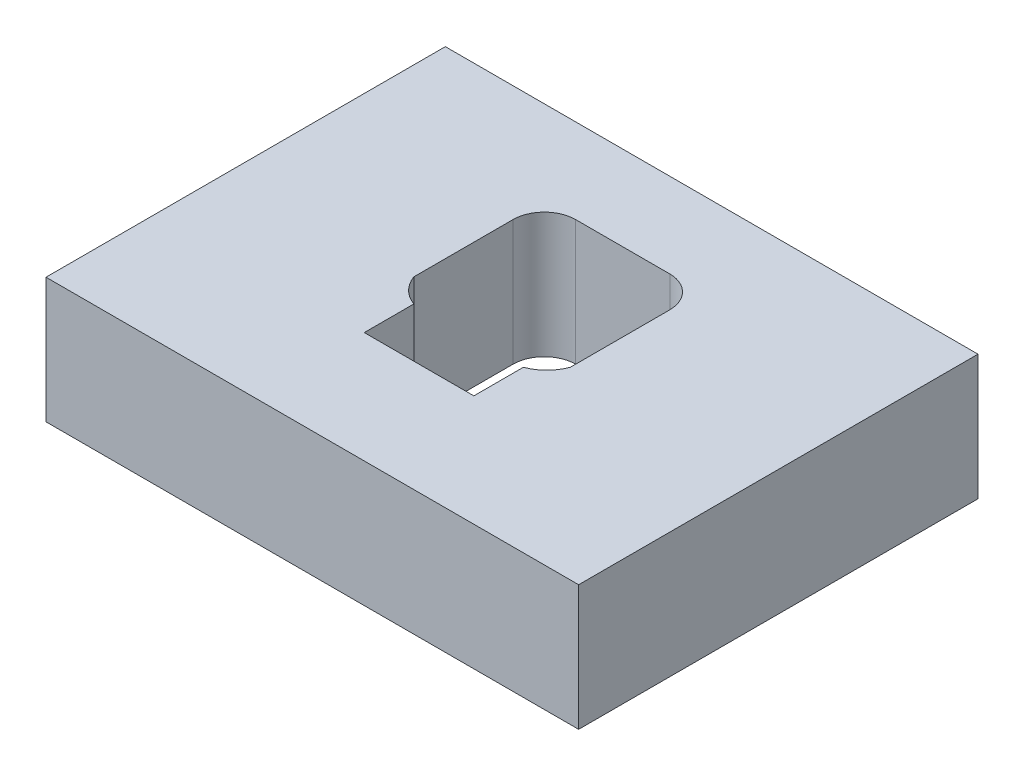
ISO-10303-21;
HEADER;
FILE_DESCRIPTION(('STEP AP214'),'2;1');
FILE_NAME('part.step','',(''),(''),'','','');
FILE_SCHEMA(('AUTOMOTIVE_DESIGN { 1 0 10303 214 1 1 1 1 }'));
ENDSEC;
DATA;
#1=APPLICATION_CONTEXT('core data for automotive mechanical design processes');
#2=APPLICATION_PROTOCOL_DEFINITION('international standard','automotive_design',2000,#1);
#3=PRODUCT_CONTEXT('',#1,'mechanical');
#4=PRODUCT('Part','Part','',(#3));
#5=PRODUCT_RELATED_PRODUCT_CATEGORY('part','',(#4));
#6=PRODUCT_DEFINITION_FORMATION('','',#4);
#7=PRODUCT_DEFINITION_CONTEXT('part definition',#1,'design');
#8=PRODUCT_DEFINITION('design','',#6,#7);
#9=PRODUCT_DEFINITION_SHAPE('','',#8);
#10=(LENGTH_UNIT() NAMED_UNIT(*) SI_UNIT(.MILLI.,.METRE.));
#11=(NAMED_UNIT(*) PLANE_ANGLE_UNIT() SI_UNIT($,.RADIAN.));
#12=(NAMED_UNIT(*) SI_UNIT($,.STERADIAN.) SOLID_ANGLE_UNIT());
#13=UNCERTAINTY_MEASURE_WITH_UNIT(LENGTH_MEASURE(1.E-05),#10,'distance_accuracy_value','');
#14=(GEOMETRIC_REPRESENTATION_CONTEXT(3) GLOBAL_UNCERTAINTY_ASSIGNED_CONTEXT((#13)) GLOBAL_UNIT_ASSIGNED_CONTEXT((#10,
#11,#12)) REPRESENTATION_CONTEXT('',''));
#15=CARTESIAN_POINT('',(0.,0.,0.));
#16=DIRECTION('',(0.,0.,1.));
#17=DIRECTION('',(1.,0.,0.));
#18=AXIS2_PLACEMENT_3D('',#15,#16,#17);
#19=CARTESIAN_POINT('',(-4.8,8.,0.));
#20=DIRECTION('',(1.,0.,0.));
#21=DIRECTION('',(0.,0.,-1.));
#22=AXIS2_PLACEMENT_3D('',#19,#20,#21);
#23=PLANE('',#22);
#24=DIRECTION('',(0.,0.,1.));
#25=VECTOR('',#24,1.);
#26=CARTESIAN_POINT('',(-4.8,0.,0.));
#27=LINE('',#26,#25);
#28=CARTESIAN_POINT('',(-4.8,0.,-19.7));
#29=VERTEX_POINT('',#28);
#30=CARTESIAN_POINT('',(-4.8,0.,5.80539238842786));
#31=VERTEX_POINT('',#30);
#32=EDGE_CURVE('E220',#29,#31,#27,.T.);
#33=ORIENTED_EDGE('',*,*,#32,.F.);
#34=DIRECTION('',(0.,-1.,0.));
#35=VECTOR('',#34,1.);
#36=CARTESIAN_POINT('',(-4.8,8.,-19.7));
#37=LINE('',#36,#35);
#38=CARTESIAN_POINT('',(-4.8,8.,-19.7));
#39=VERTEX_POINT('',#38);
#40=EDGE_CURVE('E11',#39,#29,#37,.T.);
#41=ORIENTED_EDGE('',*,*,#40,.F.);
#42=DIRECTION('',(0.,0.,1.));
#43=VECTOR('',#42,1.);
#44=CARTESIAN_POINT('',(-4.8,8.,0.));
#45=LINE('',#44,#43);
#46=CARTESIAN_POINT('',(-4.8,8.,5.80539238842786));
#47=VERTEX_POINT('',#46);
#48=EDGE_CURVE('E171',#39,#47,#45,.T.);
#49=ORIENTED_EDGE('',*,*,#48,.T.);
#50=DIRECTION('',(0.,-1.,0.));
#51=VECTOR('',#50,1.);
#52=CARTESIAN_POINT('',(-4.8,8.,5.80539238842786));
#53=LINE('',#52,#51);
#54=EDGE_CURVE('E112',#47,#31,#53,.T.);
#55=ORIENTED_EDGE('',*,*,#54,.T.);
#56=EDGE_LOOP('',(#33,#41,#49,#55));
#57=FACE_BOUND('',#56,.T.);
#58=ADVANCED_FACE('F39',(#57),#23,.T.);
#59=CARTESIAN_POINT('',(0.,8.,-19.7));
#60=DIRECTION('',(0.,0.,-1.));
#61=DIRECTION('',(-1.,0.,0.));
#62=AXIS2_PLACEMENT_3D('',#59,#60,#61);
#63=PLANE('',#62);
#64=DIRECTION('',(1.,0.,0.));
#65=VECTOR('',#64,1.);
#66=CARTESIAN_POINT('',(0.,0.,-19.7));
#67=LINE('',#66,#65);
#68=CARTESIAN_POINT('',(-38.8187501826179,0.,-19.7));
#69=VERTEX_POINT('',#68);
#70=EDGE_CURVE('E159',#69,#29,#67,.T.);
#71=ORIENTED_EDGE('',*,*,#70,.F.);
#72=DIRECTION('',(0.,-1.,0.));
#73=VECTOR('',#72,1.);
#74=CARTESIAN_POINT('',(-38.8187501826179,8.,-19.7));
#75=LINE('',#74,#73);
#76=CARTESIAN_POINT('',(-38.8187501826179,8.,-19.7));
#77=VERTEX_POINT('',#76);
#78=EDGE_CURVE('E50',#77,#69,#75,.T.);
#79=ORIENTED_EDGE('',*,*,#78,.F.);
#80=DIRECTION('',(1.,0.,0.));
#81=VECTOR('',#80,1.);
#82=CARTESIAN_POINT('',(0.,8.,-19.7));
#83=LINE('',#82,#81);
#84=EDGE_CURVE('E157',#77,#39,#83,.T.);
#85=ORIENTED_EDGE('',*,*,#84,.T.);
#86=ORIENTED_EDGE('',*,*,#40,.T.);
#87=EDGE_LOOP('',(#71,#79,#85,#86));
#88=FACE_BOUND('',#87,.T.);
#89=ADVANCED_FACE('F155',(#88),#63,.T.);
#90=CARTESIAN_POINT('',(-38.8187501826179,8.,0.));
#91=DIRECTION('',(1.,0.,0.));
#92=DIRECTION('',(0.,0.,-1.));
#93=AXIS2_PLACEMENT_3D('',#90,#91,#92);
#94=PLANE('',#93);
#95=DIRECTION('',(0.,0.,1.));
#96=VECTOR('',#95,1.);
#97=CARTESIAN_POINT('',(-38.8187501826179,0.,0.));
#98=LINE('',#97,#96);
#99=CARTESIAN_POINT('',(-38.8187501826179,0.,5.80539238842786));
#100=VERTEX_POINT('',#99);
#101=EDGE_CURVE('E225',#69,#100,#98,.T.);
#102=ORIENTED_EDGE('',*,*,#101,.T.);
#103=DIRECTION('',(0.,-1.,0.));
#104=VECTOR('',#103,1.);
#105=CARTESIAN_POINT('',(-38.8187501826179,8.,5.80539238842786));
#106=LINE('',#105,#104);
#107=CARTESIAN_POINT('',(-38.8187501826179,8.,5.80539238842786));
#108=VERTEX_POINT('',#107);
#109=EDGE_CURVE('E163',#108,#100,#106,.T.);
#110=ORIENTED_EDGE('',*,*,#109,.F.);
#111=DIRECTION('',(0.,0.,1.));
#112=VECTOR('',#111,1.);
#113=CARTESIAN_POINT('',(-38.8187501826179,8.,0.));
#114=LINE('',#113,#112);
#115=EDGE_CURVE('E166',#77,#108,#114,.T.);
#116=ORIENTED_EDGE('',*,*,#115,.F.);
#117=ORIENTED_EDGE('',*,*,#78,.T.);
#118=EDGE_LOOP('',(#102,#110,#116,#117));
#119=FACE_BOUND('',#118,.T.);
#120=ADVANCED_FACE('F167',(#119),#94,.F.);
#121=CARTESIAN_POINT('',(-25.5932092744701,8.,0.));
#122=DIRECTION('',(-1.,0.,0.));
#123=DIRECTION('',(0.,0.,1.));
#124=AXIS2_PLACEMENT_3D('',#121,#122,#123);
#125=PLANE('',#124);
#126=DIRECTION('',(0.,0.,-1.));
#127=VECTOR('',#126,1.);
#128=CARTESIAN_POINT('',(-25.5932092744701,0.,0.));
#129=LINE('',#128,#127);
#130=CARTESIAN_POINT('',(-25.5932092744701,0.,-1.29582559844537));
#131=VERTEX_POINT('',#130);
#132=CARTESIAN_POINT('',(-25.5932092744701,0.,-4.45632170294879));
#133=VERTEX_POINT('',#132);
#134=EDGE_CURVE('E182',#131,#133,#129,.T.);
#135=ORIENTED_EDGE('',*,*,#134,.T.);
#136=DIRECTION('',(0.,-1.,0.));
#137=VECTOR('',#136,1.);
#138=CARTESIAN_POINT('',(-25.5932092744701,8.,-4.45632170294879));
#139=LINE('',#138,#137);
#140=CARTESIAN_POINT('',(-25.5932092744701,8.,-4.45632170294879));
#141=VERTEX_POINT('',#140);
#142=EDGE_CURVE('E43',#141,#133,#139,.T.);
#143=ORIENTED_EDGE('',*,*,#142,.F.);
#144=DIRECTION('',(0.,0.,-1.));
#145=VECTOR('',#144,1.);
#146=CARTESIAN_POINT('',(-25.5932092744701,8.,0.));
#147=LINE('',#146,#145);
#148=CARTESIAN_POINT('',(-25.5932092744701,8.,-1.29582559844537));
#149=VERTEX_POINT('',#148);
#150=EDGE_CURVE('E230',#149,#141,#147,.T.);
#151=ORIENTED_EDGE('',*,*,#150,.F.);
#152=DIRECTION('',(0.,-1.,0.));
#153=VECTOR('',#152,1.);
#154=CARTESIAN_POINT('',(-25.5932092744701,8.,-1.29582559844537));
#155=LINE('',#154,#153);
#156=EDGE_CURVE('E181',#149,#131,#155,.T.);
#157=ORIENTED_EDGE('',*,*,#156,.T.);
#158=EDGE_LOOP('',(#135,#143,#151,#157));
#159=FACE_BOUND('',#158,.T.);
#160=ADVANCED_FACE('F41',(#159),#125,.F.);
#161=CARTESIAN_POINT('',(-24.7018389720169,8.,-6.8474423698976));
#162=DIRECTION('',(0.,-1.,0.));
#163=DIRECTION('',(0.,0.,-1.));
#164=AXIS2_PLACEMENT_3D('',#161,#162,#163);
#165=CYLINDRICAL_SURFACE('',#164,2.55186188105963);
#166=CARTESIAN_POINT('',(-24.7018389720169,0.,-6.8474423698976));
#167=DIRECTION('',(0.,1.,0.));
#168=DIRECTION('',(0.,0.,1.));
#169=AXIS2_PLACEMENT_3D('',#166,#167,#168);
#170=CIRCLE('',#169,2.55186188105963);
#171=CARTESIAN_POINT('',(-27.0932092744701,0.,-5.9567420069527));
#172=VERTEX_POINT('',#171);
#173=EDGE_CURVE('E186',#133,#172,#170,.F.);
#174=ORIENTED_EDGE('',*,*,#173,.T.);
#175=DIRECTION('',(0.,-1.,0.));
#176=VECTOR('',#175,1.);
#177=CARTESIAN_POINT('',(-27.0932092744701,8.,-5.9567420069527));
#178=LINE('',#177,#176);
#179=CARTESIAN_POINT('',(-27.0932092744701,8.,-5.9567420069527));
#180=VERTEX_POINT('',#179);
#181=EDGE_CURVE('E258',#180,#172,#178,.T.);
#182=ORIENTED_EDGE('',*,*,#181,.F.);
#183=CARTESIAN_POINT('',(-24.7018389720169,8.,-6.8474423698976));
#184=DIRECTION('',(0.,1.,0.));
#185=DIRECTION('',(0.,0.,1.));
#186=AXIS2_PLACEMENT_3D('',#183,#184,#185);
#187=CIRCLE('',#186,2.55186188105963);
#188=EDGE_CURVE('E120',#141,#180,#187,.F.);
#189=ORIENTED_EDGE('',*,*,#188,.F.);
#190=ORIENTED_EDGE('',*,*,#142,.T.);
#191=EDGE_LOOP('',(#174,#182,#189,#190));
#192=FACE_BOUND('',#191,.T.);
#193=ADVANCED_FACE('F266',(#192),#165,.F.);
#194=CARTESIAN_POINT('',(-27.0932092744701,8.,0.));
#195=DIRECTION('',(-1.,0.,0.));
#196=DIRECTION('',(0.,0.,1.));
#197=AXIS2_PLACEMENT_3D('',#194,#195,#196);
#198=PLANE('',#197);
#199=DIRECTION('',(0.,0.,-1.));
#200=VECTOR('',#199,1.);
#201=CARTESIAN_POINT('',(-27.0932092744701,0.,0.));
#202=LINE('',#201,#200);
#203=CARTESIAN_POINT('',(-27.0932092744701,0.,-12.2817285921435));
#204=VERTEX_POINT('',#203);
#205=EDGE_CURVE('E189',#172,#204,#202,.T.);
#206=ORIENTED_EDGE('',*,*,#205,.T.);
#207=DIRECTION('',(0.,-1.,0.));
#208=VECTOR('',#207,1.);
#209=CARTESIAN_POINT('',(-27.0932092744701,8.,-12.2817285921435));
#210=LINE('',#209,#208);
#211=CARTESIAN_POINT('',(-27.0932092744701,8.,-12.2817285921435));
#212=VERTEX_POINT('',#211);
#213=EDGE_CURVE('E256',#212,#204,#210,.T.);
#214=ORIENTED_EDGE('',*,*,#213,.F.);
#215=DIRECTION('',(0.,0.,-1.));
#216=VECTOR('',#215,1.);
#217=CARTESIAN_POINT('',(-27.0932092744701,8.,0.));
#218=LINE('',#217,#216);
#219=EDGE_CURVE('E501',#180,#212,#218,.T.);
#220=ORIENTED_EDGE('',*,*,#219,.F.);
#221=ORIENTED_EDGE('',*,*,#181,.T.);
#222=EDGE_LOOP('',(#206,#214,#220,#221));
#223=FACE_BOUND('',#222,.T.);
#224=ADVANCED_FACE('F310',(#223),#198,.F.);
#225=CARTESIAN_POINT('',(-25.0932593097926,8.,-12.2958756337679));
#226=DIRECTION('',(0.,-1.,0.));
#227=DIRECTION('',(0.,0.,-1.));
#228=AXIS2_PLACEMENT_3D('',#225,#226,#227);
#229=CYLINDRICAL_SURFACE('',#228,2.00000000000001);
#230=CARTESIAN_POINT('',(-25.0932593097926,0.,-12.2958756337679));
#231=DIRECTION('',(0.,1.,0.));
#232=DIRECTION('',(0.,0.,1.));
#233=AXIS2_PLACEMENT_3D('',#230,#231,#232);
#234=CIRCLE('',#233,2.00000000000001);
#235=CARTESIAN_POINT('',(-25.1074063514204,0.,-14.2958255984454));
#236=VERTEX_POINT('',#235);
#237=EDGE_CURVE('E193',#236,#204,#234,.T.);
#238=ORIENTED_EDGE('',*,*,#237,.F.);
#239=DIRECTION('',(0.,-1.,0.));
#240=VECTOR('',#239,1.);
#241=CARTESIAN_POINT('',(-25.1074063514204,8.,-14.2958255984454));
#242=LINE('',#241,#240);
#243=CARTESIAN_POINT('',(-25.1074063514204,8.,-14.2958255984454));
#244=VERTEX_POINT('',#243);
#245=EDGE_CURVE('E253',#244,#236,#242,.T.);
#246=ORIENTED_EDGE('',*,*,#245,.F.);
#247=CARTESIAN_POINT('',(-25.0932593097926,8.,-12.2958756337679));
#248=DIRECTION('',(0.,1.,0.));
#249=DIRECTION('',(0.,0.,1.));
#250=AXIS2_PLACEMENT_3D('',#247,#248,#249);
#251=CIRCLE('',#250,2.00000000000001);
#252=EDGE_CURVE('E309',#244,#212,#251,.T.);
#253=ORIENTED_EDGE('',*,*,#252,.T.);
#254=ORIENTED_EDGE('',*,*,#213,.T.);
#255=EDGE_LOOP('',(#238,#246,#253,#254));
#256=FACE_BOUND('',#255,.T.);
#257=ADVANCED_FACE('F304',(#256),#229,.F.);
#258=CARTESIAN_POINT('',(0.,8.,-14.2958255984454));
#259=DIRECTION('',(0.,0.,-1.));
#260=DIRECTION('',(-1.,0.,0.));
#261=AXIS2_PLACEMENT_3D('',#258,#259,#260);
#262=PLANE('',#261);
#263=DIRECTION('',(1.,0.,0.));
#264=VECTOR('',#263,1.);
#265=CARTESIAN_POINT('',(0.,0.,-14.2958255984454));
#266=LINE('',#265,#264);
#267=CARTESIAN_POINT('',(-19.0790121975192,0.,-14.2958255984454));
#268=VERTEX_POINT('',#267);
#269=EDGE_CURVE('E197',#236,#268,#266,.T.);
#270=ORIENTED_EDGE('',*,*,#269,.T.);
#271=DIRECTION('',(0.,-1.,0.));
#272=VECTOR('',#271,1.);
#273=CARTESIAN_POINT('',(-19.0790121975192,8.,-14.2958255984454));
#274=LINE('',#273,#272);
#275=CARTESIAN_POINT('',(-19.0790121975192,8.,-14.2958255984454));
#276=VERTEX_POINT('',#275);
#277=EDGE_CURVE('E249',#276,#268,#274,.T.);
#278=ORIENTED_EDGE('',*,*,#277,.F.);
#279=DIRECTION('',(1.,0.,0.));
#280=VECTOR('',#279,1.);
#281=CARTESIAN_POINT('',(0.,8.,-14.2958255984454));
#282=LINE('',#281,#280);
#283=EDGE_CURVE('E508',#244,#276,#282,.T.);
#284=ORIENTED_EDGE('',*,*,#283,.F.);
#285=ORIENTED_EDGE('',*,*,#245,.T.);
#286=EDGE_LOOP('',(#270,#278,#284,#285));
#287=FACE_BOUND('',#286,.T.);
#288=ADVANCED_FACE('F317',(#287),#262,.F.);
#289=CARTESIAN_POINT('',(-19.0931592391475,8.,-12.295875633768));
#290=DIRECTION('',(0.,-1.,0.));
#291=DIRECTION('',(0.,0.,-1.));
#292=AXIS2_PLACEMENT_3D('',#289,#290,#291);
#293=CYLINDRICAL_SURFACE('',#292,2.00000000000001);
#294=CARTESIAN_POINT('',(-19.0931592391475,0.,-12.295875633768));
#295=DIRECTION('',(0.,1.,0.));
#296=DIRECTION('',(0.,0.,1.));
#297=AXIS2_PLACEMENT_3D('',#294,#295,#296);
#298=CIRCLE('',#297,2.00000000000001);
#299=CARTESIAN_POINT('',(-17.09320927447,0.,-12.2817285921433));
#300=VERTEX_POINT('',#299);
#301=EDGE_CURVE('E200',#268,#300,#298,.F.);
#302=ORIENTED_EDGE('',*,*,#301,.T.);
#303=DIRECTION('',(0.,-1.,0.));
#304=VECTOR('',#303,1.);
#305=CARTESIAN_POINT('',(-17.09320927447,8.,-12.2817285921433));
#306=LINE('',#305,#304);
#307=CARTESIAN_POINT('',(-17.09320927447,8.,-12.2817285921433));
#308=VERTEX_POINT('',#307);
#309=EDGE_CURVE('E246',#308,#300,#306,.T.);
#310=ORIENTED_EDGE('',*,*,#309,.F.);
#311=CARTESIAN_POINT('',(-19.0931592391475,8.,-12.295875633768));
#312=DIRECTION('',(0.,1.,0.));
#313=DIRECTION('',(0.,0.,1.));
#314=AXIS2_PLACEMENT_3D('',#311,#312,#313);
#315=CIRCLE('',#314,2.00000000000001);
#316=EDGE_CURVE('E511',#276,#308,#315,.F.);
#317=ORIENTED_EDGE('',*,*,#316,.F.);
#318=ORIENTED_EDGE('',*,*,#277,.T.);
#319=EDGE_LOOP('',(#302,#310,#317,#318));
#320=FACE_BOUND('',#319,.T.);
#321=ADVANCED_FACE('F298',(#320),#293,.F.);
#322=CARTESIAN_POINT('',(-17.0932092744701,8.,0.));
#323=DIRECTION('',(-1.,0.,0.));
#324=DIRECTION('',(0.,0.,1.));
#325=AXIS2_PLACEMENT_3D('',#322,#323,#324);
#326=PLANE('',#325);
#327=DIRECTION('',(0.,0.,-1.));
#328=VECTOR('',#327,1.);
#329=CARTESIAN_POINT('',(-17.0932092744701,0.,0.));
#330=LINE('',#329,#328);
#331=CARTESIAN_POINT('',(-17.09320927447,0.,-5.95674200695269));
#332=VERTEX_POINT('',#331);
#333=EDGE_CURVE('E204',#332,#300,#330,.T.);
#334=ORIENTED_EDGE('',*,*,#333,.F.);
#335=DIRECTION('',(0.,-1.,0.));
#336=VECTOR('',#335,1.);
#337=CARTESIAN_POINT('',(-17.09320927447,8.,-5.95674200695269));
#338=LINE('',#337,#336);
#339=CARTESIAN_POINT('',(-17.09320927447,8.,-5.95674200695269));
#340=VERTEX_POINT('',#339);
#341=EDGE_CURVE('E243',#340,#332,#338,.T.);
#342=ORIENTED_EDGE('',*,*,#341,.F.);
#343=DIRECTION('',(0.,0.,-1.));
#344=VECTOR('',#343,1.);
#345=CARTESIAN_POINT('',(-17.0932092744701,8.,0.));
#346=LINE('',#345,#344);
#347=EDGE_CURVE('E295',#340,#308,#346,.T.);
#348=ORIENTED_EDGE('',*,*,#347,.T.);
#349=ORIENTED_EDGE('',*,*,#309,.T.);
#350=EDGE_LOOP('',(#334,#342,#348,#349));
#351=FACE_BOUND('',#350,.T.);
#352=ADVANCED_FACE('F293',(#351),#326,.T.);
#353=CARTESIAN_POINT('',(-19.4845795769232,8.,-6.84744236989761));
#354=DIRECTION('',(0.,-1.,0.));
#355=DIRECTION('',(0.,0.,-1.));
#356=AXIS2_PLACEMENT_3D('',#353,#354,#355);
#357=CYLINDRICAL_SURFACE('',#356,2.55186188105962);
#358=CARTESIAN_POINT('',(-19.4845795769232,0.,-6.84744236989761));
#359=DIRECTION('',(0.,1.,0.));
#360=DIRECTION('',(0.,0.,1.));
#361=AXIS2_PLACEMENT_3D('',#358,#359,#360);
#362=CIRCLE('',#361,2.55186188105962);
#363=CARTESIAN_POINT('',(-18.59320927447,0.,-4.4563217029488));
#364=VERTEX_POINT('',#363);
#365=EDGE_CURVE('E208',#364,#332,#362,.T.);
#366=ORIENTED_EDGE('',*,*,#365,.F.);
#367=DIRECTION('',(0.,-1.,0.));
#368=VECTOR('',#367,1.);
#369=CARTESIAN_POINT('',(-18.59320927447,8.,-4.4563217029488));
#370=LINE('',#369,#368);
#371=CARTESIAN_POINT('',(-18.59320927447,8.,-4.4563217029488));
#372=VERTEX_POINT('',#371);
#373=EDGE_CURVE('E240',#372,#364,#370,.T.);
#374=ORIENTED_EDGE('',*,*,#373,.F.);
#375=CARTESIAN_POINT('',(-19.4845795769232,8.,-6.84744236989761));
#376=DIRECTION('',(0.,1.,0.));
#377=DIRECTION('',(0.,0.,1.));
#378=AXIS2_PLACEMENT_3D('',#375,#376,#377);
#379=CIRCLE('',#378,2.55186188105962);
#380=EDGE_CURVE('E289',#372,#340,#379,.T.);
#381=ORIENTED_EDGE('',*,*,#380,.T.);
#382=ORIENTED_EDGE('',*,*,#341,.T.);
#383=EDGE_LOOP('',(#366,#374,#381,#382));
#384=FACE_BOUND('',#383,.T.);
#385=ADVANCED_FACE('F286',(#384),#357,.F.);
#386=CARTESIAN_POINT('',(-18.59320927447,8.,0.));
#387=DIRECTION('',(-1.,0.,0.));
#388=DIRECTION('',(0.,0.,1.));
#389=AXIS2_PLACEMENT_3D('',#386,#387,#388);
#390=PLANE('',#389);
#391=DIRECTION('',(0.,0.,-1.));
#392=VECTOR('',#391,1.);
#393=CARTESIAN_POINT('',(-18.59320927447,0.,0.));
#394=LINE('',#393,#392);
#395=CARTESIAN_POINT('',(-18.59320927447,0.,-1.29582559844537));
#396=VERTEX_POINT('',#395);
#397=EDGE_CURVE('E212',#396,#364,#394,.T.);
#398=ORIENTED_EDGE('',*,*,#397,.F.);
#399=DIRECTION('',(0.,-1.,0.));
#400=VECTOR('',#399,1.);
#401=CARTESIAN_POINT('',(-18.59320927447,8.,-1.29582559844537));
#402=LINE('',#401,#400);
#403=CARTESIAN_POINT('',(-18.59320927447,8.,-1.29582559844537));
#404=VERTEX_POINT('',#403);
#405=EDGE_CURVE('E237',#404,#396,#402,.T.);
#406=ORIENTED_EDGE('',*,*,#405,.F.);
#407=DIRECTION('',(0.,0.,-1.));
#408=VECTOR('',#407,1.);
#409=CARTESIAN_POINT('',(-18.59320927447,8.,0.));
#410=LINE('',#409,#408);
#411=EDGE_CURVE('E518',#404,#372,#410,.T.);
#412=ORIENTED_EDGE('',*,*,#411,.T.);
#413=ORIENTED_EDGE('',*,*,#373,.T.);
#414=EDGE_LOOP('',(#398,#406,#412,#413));
#415=FACE_BOUND('',#414,.T.);
#416=ADVANCED_FACE('F281',(#415),#390,.T.);
#417=CARTESIAN_POINT('',(0.,8.,-1.29582559844538));
#418=DIRECTION('',(0.,0.,-1.));
#419=DIRECTION('',(-1.,0.,0.));
#420=AXIS2_PLACEMENT_3D('',#417,#418,#419);
#421=PLANE('',#420);
#422=DIRECTION('',(1.,0.,0.));
#423=VECTOR('',#422,1.);
#424=CARTESIAN_POINT('',(0.,0.,-1.29582559844538));
#425=LINE('',#424,#423);
#426=EDGE_CURVE('E216',#131,#396,#425,.T.);
#427=ORIENTED_EDGE('',*,*,#426,.F.);
#428=ORIENTED_EDGE('',*,*,#156,.F.);
#429=DIRECTION('',(1.,0.,0.));
#430=VECTOR('',#429,1.);
#431=CARTESIAN_POINT('',(0.,8.,-1.29582559844538));
#432=LINE('',#431,#430);
#433=EDGE_CURVE('E175',#149,#404,#432,.T.);
#434=ORIENTED_EDGE('',*,*,#433,.T.);
#435=ORIENTED_EDGE('',*,*,#405,.T.);
#436=EDGE_LOOP('',(#427,#428,#434,#435));
#437=FACE_BOUND('',#436,.T.);
#438=ADVANCED_FACE('F274',(#437),#421,.T.);
#439=CARTESIAN_POINT('',(0.,8.,5.80539238842786));
#440=DIRECTION('',(0.,0.,-1.));
#441=DIRECTION('',(-1.,0.,0.));
#442=AXIS2_PLACEMENT_3D('',#439,#440,#441);
#443=PLANE('',#442);
#444=DIRECTION('',(1.,0.,0.));
#445=VECTOR('',#444,1.);
#446=CARTESIAN_POINT('',(0.,0.,5.80539238842786));
#447=LINE('',#446,#445);
#448=EDGE_CURVE('E105',#100,#31,#447,.T.);
#449=ORIENTED_EDGE('',*,*,#448,.T.);
#450=ORIENTED_EDGE('',*,*,#54,.F.);
#451=DIRECTION('',(1.,0.,0.));
#452=VECTOR('',#451,1.);
#453=CARTESIAN_POINT('',(0.,8.,5.80539238842786));
#454=LINE('',#453,#452);
#455=EDGE_CURVE('E59',#108,#47,#454,.T.);
#456=ORIENTED_EDGE('',*,*,#455,.F.);
#457=ORIENTED_EDGE('',*,*,#109,.T.);
#458=EDGE_LOOP('',(#449,#450,#456,#457));
#459=FACE_BOUND('',#458,.T.);
#460=ADVANCED_FACE('F329',(#459),#443,.F.);
#461=CARTESIAN_POINT('',(0.,8.,0.));
#462=DIRECTION('',(0.,1.,0.));
#463=DIRECTION('',(0.,0.,1.));
#464=AXIS2_PLACEMENT_3D('',#461,#462,#463);
#465=PLANE('',#464);
#466=ORIENTED_EDGE('',*,*,#150,.T.);
#467=ORIENTED_EDGE('',*,*,#188,.T.);
#468=ORIENTED_EDGE('',*,*,#219,.T.);
#469=ORIENTED_EDGE('',*,*,#252,.F.);
#470=ORIENTED_EDGE('',*,*,#283,.T.);
#471=ORIENTED_EDGE('',*,*,#316,.T.);
#472=ORIENTED_EDGE('',*,*,#347,.F.);
#473=ORIENTED_EDGE('',*,*,#380,.F.);
#474=ORIENTED_EDGE('',*,*,#411,.F.);
#475=ORIENTED_EDGE('',*,*,#433,.F.);
#476=EDGE_LOOP('',(#466,#467,#468,#469,#470,#471,#472,#473,#474,#475));
#477=FACE_BOUND('',#476,.T.);
#478=ORIENTED_EDGE('',*,*,#48,.F.);
#479=ORIENTED_EDGE('',*,*,#84,.F.);
#480=ORIENTED_EDGE('',*,*,#115,.T.);
#481=ORIENTED_EDGE('',*,*,#455,.T.);
#482=EDGE_LOOP('',(#478,#479,#480,#481));
#483=FACE_BOUND('',#482,.T.);
#484=ADVANCED_FACE('F170',(#477,#483),#465,.T.);
#485=CARTESIAN_POINT('',(0.,0.,0.));
#486=DIRECTION('',(0.,1.,0.));
#487=DIRECTION('',(0.,0.,1.));
#488=AXIS2_PLACEMENT_3D('',#485,#486,#487);
#489=PLANE('',#488);
#490=ORIENTED_EDGE('',*,*,#134,.F.);
#491=ORIENTED_EDGE('',*,*,#426,.T.);
#492=ORIENTED_EDGE('',*,*,#397,.T.);
#493=ORIENTED_EDGE('',*,*,#365,.T.);
#494=ORIENTED_EDGE('',*,*,#333,.T.);
#495=ORIENTED_EDGE('',*,*,#301,.F.);
#496=ORIENTED_EDGE('',*,*,#269,.F.);
#497=ORIENTED_EDGE('',*,*,#237,.T.);
#498=ORIENTED_EDGE('',*,*,#205,.F.);
#499=ORIENTED_EDGE('',*,*,#173,.F.);
#500=EDGE_LOOP('',(#490,#491,#492,#493,#494,#495,#496,#497,#498,#499));
#501=FACE_BOUND('',#500,.T.);
#502=ORIENTED_EDGE('',*,*,#32,.T.);
#503=ORIENTED_EDGE('',*,*,#448,.F.);
#504=ORIENTED_EDGE('',*,*,#101,.F.);
#505=ORIENTED_EDGE('',*,*,#70,.T.);
#506=EDGE_LOOP('',(#502,#503,#504,#505));
#507=FACE_BOUND('',#506,.T.);
#508=ADVANCED_FACE('F272',(#501,#507),#489,.F.);
#509=CLOSED_SHELL('',(#58,#89,#120,#160,#193,#224,#257,#288,#321,#352,#385,#416,#438,#460,#484,#508));
#510=MANIFOLD_SOLID_BREP('B2',#509);
#511=ADVANCED_BREP_SHAPE_REPRESENTATION('',(#18,#510),#14);
#512=SHAPE_DEFINITION_REPRESENTATION(#9,#511);
ENDSEC;
END-ISO-10303-21;
